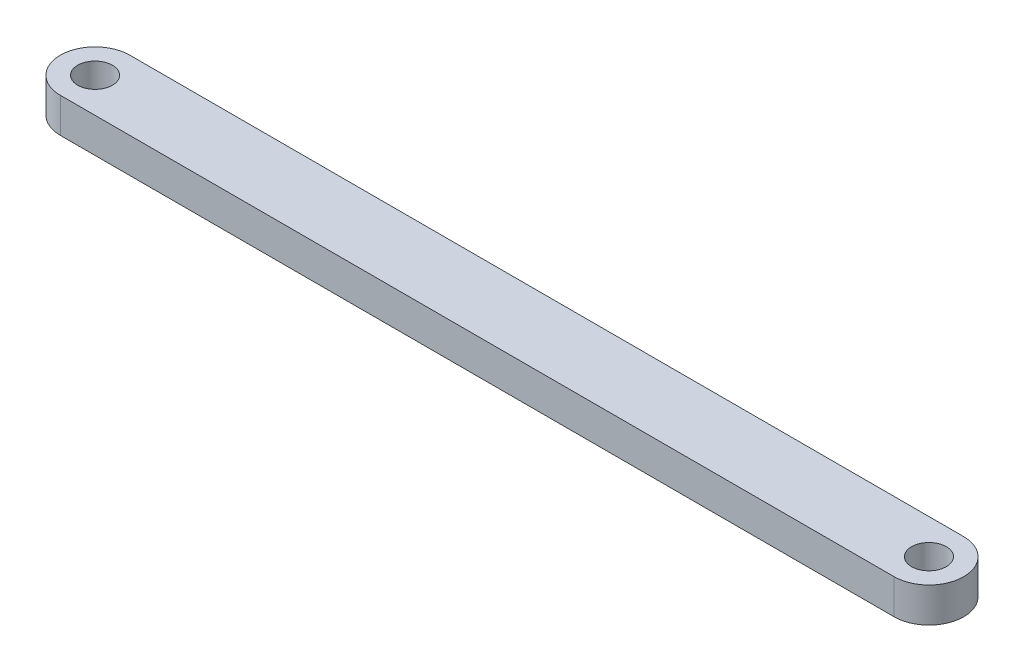
ISO-10303-21;
HEADER;
FILE_DESCRIPTION(('STEP AP214'),'2;1');
FILE_NAME('part.step','',(''),(''),'','','');
FILE_SCHEMA(('AUTOMOTIVE_DESIGN { 1 0 10303 214 1 1 1 1 }'));
ENDSEC;
DATA;
#1=APPLICATION_CONTEXT('core data for automotive mechanical design processes');
#2=APPLICATION_PROTOCOL_DEFINITION('international standard','automotive_design',2000,#1);
#3=PRODUCT_CONTEXT('',#1,'mechanical');
#4=PRODUCT('Part','Part','',(#3));
#5=PRODUCT_RELATED_PRODUCT_CATEGORY('part','',(#4));
#6=PRODUCT_DEFINITION_FORMATION('','',#4);
#7=PRODUCT_DEFINITION_CONTEXT('part definition',#1,'design');
#8=PRODUCT_DEFINITION('design','',#6,#7);
#9=PRODUCT_DEFINITION_SHAPE('','',#8);
#10=(LENGTH_UNIT() NAMED_UNIT(*) SI_UNIT(.MILLI.,.METRE.));
#11=(NAMED_UNIT(*) PLANE_ANGLE_UNIT() SI_UNIT($,.RADIAN.));
#12=(NAMED_UNIT(*) SI_UNIT($,.STERADIAN.) SOLID_ANGLE_UNIT());
#13=UNCERTAINTY_MEASURE_WITH_UNIT(LENGTH_MEASURE(1.E-05),#10,'distance_accuracy_value','');
#14=(GEOMETRIC_REPRESENTATION_CONTEXT(3) GLOBAL_UNCERTAINTY_ASSIGNED_CONTEXT((#13)) GLOBAL_UNIT_ASSIGNED_CONTEXT((#10,
#11,#12)) REPRESENTATION_CONTEXT('',''));
#15=CARTESIAN_POINT('',(0.,0.,0.));
#16=DIRECTION('',(0.,0.,1.));
#17=DIRECTION('',(1.,0.,0.));
#18=AXIS2_PLACEMENT_3D('',#15,#16,#17);
#19=CARTESIAN_POINT('',(60.,5.,0.));
#20=DIRECTION('',(0.,1.,0.));
#21=DIRECTION('',(0.,0.,1.));
#22=AXIS2_PLACEMENT_3D('',#19,#20,#21);
#23=PLANE('',#22);
#24=CARTESIAN_POINT('',(60.,5.,0.));
#25=DIRECTION('',(0.,1.,0.));
#26=DIRECTION('',(0.,0.,1.));
#27=AXIS2_PLACEMENT_3D('',#24,#25,#26);
#28=CIRCLE('',#27,2.50000000000002);
#29=CARTESIAN_POINT('',(60.,5.,2.49999999999999));
#30=VERTEX_POINT('',#29);
#31=EDGE_CURVE('E115',#30,#30,#28,.T.);
#32=ORIENTED_EDGE('',*,*,#31,.F.);
#33=EDGE_LOOP('',(#32));
#34=FACE_BOUND('',#33,.T.);
#35=CARTESIAN_POINT('',(60.,5.,0.));
#36=DIRECTION('',(0.,1.,0.));
#37=DIRECTION('',(0.,0.,1.));
#38=AXIS2_PLACEMENT_3D('',#35,#36,#37);
#39=CIRCLE('',#38,4.99999999999998);
#40=CARTESIAN_POINT('',(60.,5.,4.99999999999995));
#41=VERTEX_POINT('',#40);
#42=CARTESIAN_POINT('',(60.,5.,-5.));
#43=VERTEX_POINT('',#42);
#44=EDGE_CURVE('E95',#41,#43,#39,.T.);
#45=ORIENTED_EDGE('',*,*,#44,.T.);
#46=DIRECTION('',(-1.,0.,0.));
#47=VECTOR('',#46,1.);
#48=CARTESIAN_POINT('',(60.,5.,-5.));
#49=LINE('',#48,#47);
#50=CARTESIAN_POINT('',(-60.,5.,-4.99999999999996));
#51=VERTEX_POINT('',#50);
#52=EDGE_CURVE('E90',#43,#51,#49,.T.);
#53=ORIENTED_EDGE('',*,*,#52,.T.);
#54=CARTESIAN_POINT('',(-60.,5.,0.));
#55=DIRECTION('',(0.,1.,0.));
#56=DIRECTION('',(0.,0.,1.));
#57=AXIS2_PLACEMENT_3D('',#54,#55,#56);
#58=CIRCLE('',#57,4.99999999999998);
#59=CARTESIAN_POINT('',(-60.,5.,4.99999999999999));
#60=VERTEX_POINT('',#59);
#61=EDGE_CURVE('E93',#51,#60,#58,.T.);
#62=ORIENTED_EDGE('',*,*,#61,.T.);
#63=DIRECTION('',(1.,0.,0.));
#64=VECTOR('',#63,1.);
#65=CARTESIAN_POINT('',(60.,5.,4.99999999999995));
#66=LINE('',#65,#64);
#67=EDGE_CURVE('E60',#60,#41,#66,.T.);
#68=ORIENTED_EDGE('',*,*,#67,.T.);
#69=EDGE_LOOP('',(#45,#53,#62,#68));
#70=FACE_BOUND('',#69,.T.);
#71=CARTESIAN_POINT('',(-60.,5.,0.));
#72=DIRECTION('',(0.,1.,0.));
#73=DIRECTION('',(0.,0.,1.));
#74=AXIS2_PLACEMENT_3D('',#71,#72,#73);
#75=CIRCLE('',#74,2.50000000000001);
#76=CARTESIAN_POINT('',(-60.,5.,2.50000000000002));
#77=VERTEX_POINT('',#76);
#78=EDGE_CURVE('E137',#77,#77,#75,.T.);
#79=ORIENTED_EDGE('',*,*,#78,.F.);
#80=EDGE_LOOP('',(#79));
#81=FACE_BOUND('',#80,.T.);
#82=ADVANCED_FACE('F42',(#34,#70,#81),#23,.T.);
#83=CARTESIAN_POINT('',(60.,0.,0.));
#84=DIRECTION('',(0.,1.,0.));
#85=DIRECTION('',(0.,0.,1.));
#86=AXIS2_PLACEMENT_3D('',#83,#84,#85);
#87=PLANE('',#86);
#88=CARTESIAN_POINT('',(60.,0.,0.));
#89=DIRECTION('',(0.,1.,0.));
#90=DIRECTION('',(0.,0.,1.));
#91=AXIS2_PLACEMENT_3D('',#88,#89,#90);
#92=CIRCLE('',#91,4.99999999999998);
#93=CARTESIAN_POINT('',(60.,0.,4.99999999999995));
#94=VERTEX_POINT('',#93);
#95=CARTESIAN_POINT('',(60.,0.,-5.));
#96=VERTEX_POINT('',#95);
#97=EDGE_CURVE('E111',#94,#96,#92,.T.);
#98=ORIENTED_EDGE('',*,*,#97,.F.);
#99=DIRECTION('',(1.,0.,0.));
#100=VECTOR('',#99,1.);
#101=CARTESIAN_POINT('',(60.,0.,4.99999999999995));
#102=LINE('',#101,#100);
#103=CARTESIAN_POINT('',(-60.,0.,4.99999999999999));
#104=VERTEX_POINT('',#103);
#105=EDGE_CURVE('E83',#104,#94,#102,.T.);
#106=ORIENTED_EDGE('',*,*,#105,.F.);
#107=CARTESIAN_POINT('',(-60.,0.,0.));
#108=DIRECTION('',(0.,1.,0.));
#109=DIRECTION('',(0.,0.,1.));
#110=AXIS2_PLACEMENT_3D('',#107,#108,#109);
#111=CIRCLE('',#110,4.99999999999998);
#112=CARTESIAN_POINT('',(-60.,0.,-4.99999999999996));
#113=VERTEX_POINT('',#112);
#114=EDGE_CURVE('E77',#113,#104,#111,.T.);
#115=ORIENTED_EDGE('',*,*,#114,.F.);
#116=DIRECTION('',(-1.,0.,0.));
#117=VECTOR('',#116,1.);
#118=CARTESIAN_POINT('',(60.,0.,-5.));
#119=LINE('',#118,#117);
#120=EDGE_CURVE('E100',#96,#113,#119,.T.);
#121=ORIENTED_EDGE('',*,*,#120,.F.);
#122=EDGE_LOOP('',(#98,#106,#115,#121));
#123=FACE_BOUND('',#122,.T.);
#124=CARTESIAN_POINT('',(60.,0.,0.));
#125=DIRECTION('',(0.,1.,0.));
#126=DIRECTION('',(0.,0.,1.));
#127=AXIS2_PLACEMENT_3D('',#124,#125,#126);
#128=CIRCLE('',#127,2.50000000000002);
#129=CARTESIAN_POINT('',(60.,0.,2.49999999999999));
#130=VERTEX_POINT('',#129);
#131=EDGE_CURVE('E133',#130,#130,#128,.T.);
#132=ORIENTED_EDGE('',*,*,#131,.T.);
#133=EDGE_LOOP('',(#132));
#134=FACE_BOUND('',#133,.T.);
#135=CARTESIAN_POINT('',(-60.,0.,0.));
#136=DIRECTION('',(0.,1.,0.));
#137=DIRECTION('',(0.,0.,1.));
#138=AXIS2_PLACEMENT_3D('',#135,#136,#137);
#139=CIRCLE('',#138,2.50000000000001);
#140=CARTESIAN_POINT('',(-60.,0.,2.50000000000002));
#141=VERTEX_POINT('',#140);
#142=EDGE_CURVE('E141',#141,#141,#139,.T.);
#143=ORIENTED_EDGE('',*,*,#142,.T.);
#144=EDGE_LOOP('',(#143));
#145=FACE_BOUND('',#144,.T.);
#146=ADVANCED_FACE('F128',(#123,#134,#145),#87,.F.);
#147=CARTESIAN_POINT('',(60.,5.,0.));
#148=DIRECTION('',(0.,-1.,0.));
#149=DIRECTION('',(0.,0.,-1.));
#150=AXIS2_PLACEMENT_3D('',#147,#148,#149);
#151=CYLINDRICAL_SURFACE('',#150,4.99999999999998);
#152=ORIENTED_EDGE('',*,*,#97,.T.);
#153=DIRECTION('',(0.,-1.,0.));
#154=VECTOR('',#153,1.);
#155=CARTESIAN_POINT('',(60.,5.,-5.));
#156=LINE('',#155,#154);
#157=EDGE_CURVE('E11',#43,#96,#156,.T.);
#158=ORIENTED_EDGE('',*,*,#157,.F.);
#159=ORIENTED_EDGE('',*,*,#44,.F.);
#160=DIRECTION('',(0.,-1.,0.));
#161=VECTOR('',#160,1.);
#162=CARTESIAN_POINT('',(60.,5.,4.99999999999995));
#163=LINE('',#162,#161);
#164=EDGE_CURVE('E107',#41,#94,#163,.T.);
#165=ORIENTED_EDGE('',*,*,#164,.T.);
#166=EDGE_LOOP('',(#152,#158,#159,#165));
#167=FACE_BOUND('',#166,.T.);
#168=ADVANCED_FACE('F44',(#167),#151,.T.);
#169=CARTESIAN_POINT('',(60.,5.,-5.));
#170=DIRECTION('',(0.,0.,1.));
#171=DIRECTION('',(1.,0.,0.));
#172=AXIS2_PLACEMENT_3D('',#169,#170,#171);
#173=PLANE('',#172);
#174=ORIENTED_EDGE('',*,*,#120,.T.);
#175=DIRECTION('',(0.,-1.,0.));
#176=VECTOR('',#175,1.);
#177=CARTESIAN_POINT('',(-60.,5.,-4.99999999999996));
#178=LINE('',#177,#176);
#179=EDGE_CURVE('E52',#51,#113,#178,.T.);
#180=ORIENTED_EDGE('',*,*,#179,.F.);
#181=ORIENTED_EDGE('',*,*,#52,.F.);
#182=ORIENTED_EDGE('',*,*,#157,.T.);
#183=EDGE_LOOP('',(#174,#180,#181,#182));
#184=FACE_BOUND('',#183,.T.);
#185=ADVANCED_FACE('F99',(#184),#173,.F.);
#186=CARTESIAN_POINT('',(-60.,5.,0.));
#187=DIRECTION('',(0.,-1.,0.));
#188=DIRECTION('',(0.,0.,-1.));
#189=AXIS2_PLACEMENT_3D('',#186,#187,#188);
#190=CYLINDRICAL_SURFACE('',#189,4.99999999999998);
#191=ORIENTED_EDGE('',*,*,#114,.T.);
#192=DIRECTION('',(0.,-1.,0.));
#193=VECTOR('',#192,1.);
#194=CARTESIAN_POINT('',(-60.,5.,4.99999999999999));
#195=LINE('',#194,#193);
#196=EDGE_CURVE('E102',#60,#104,#195,.T.);
#197=ORIENTED_EDGE('',*,*,#196,.F.);
#198=ORIENTED_EDGE('',*,*,#61,.F.);
#199=ORIENTED_EDGE('',*,*,#179,.T.);
#200=EDGE_LOOP('',(#191,#197,#198,#199));
#201=FACE_BOUND('',#200,.T.);
#202=ADVANCED_FACE('F103',(#201),#190,.T.);
#203=CARTESIAN_POINT('',(60.,5.,4.99999999999995));
#204=DIRECTION('',(0.,0.,-1.));
#205=DIRECTION('',(-1.,0.,0.));
#206=AXIS2_PLACEMENT_3D('',#203,#204,#205);
#207=PLANE('',#206);
#208=ORIENTED_EDGE('',*,*,#105,.T.);
#209=ORIENTED_EDGE('',*,*,#164,.F.);
#210=ORIENTED_EDGE('',*,*,#67,.F.);
#211=ORIENTED_EDGE('',*,*,#196,.T.);
#212=EDGE_LOOP('',(#208,#209,#210,#211));
#213=FACE_BOUND('',#212,.T.);
#214=ADVANCED_FACE('F125',(#213),#207,.F.);
#215=CARTESIAN_POINT('',(60.,5.,0.));
#216=DIRECTION('',(0.,-1.,0.));
#217=DIRECTION('',(0.,0.,-1.));
#218=AXIS2_PLACEMENT_3D('',#215,#216,#217);
#219=CYLINDRICAL_SURFACE('',#218,2.50000000000002);
#220=ORIENTED_EDGE('',*,*,#31,.T.);
#221=EDGE_LOOP('',(#220));
#222=FACE_BOUND('',#221,.T.);
#223=ORIENTED_EDGE('',*,*,#131,.F.);
#224=EDGE_LOOP('',(#223));
#225=FACE_BOUND('',#224,.T.);
#226=ADVANCED_FACE('F160',(#222,#225),#219,.F.);
#227=CARTESIAN_POINT('',(-60.,5.,0.));
#228=DIRECTION('',(0.,-1.,0.));
#229=DIRECTION('',(0.,0.,-1.));
#230=AXIS2_PLACEMENT_3D('',#227,#228,#229);
#231=CYLINDRICAL_SURFACE('',#230,2.50000000000001);
#232=ORIENTED_EDGE('',*,*,#78,.T.);
#233=EDGE_LOOP('',(#232));
#234=FACE_BOUND('',#233,.T.);
#235=ORIENTED_EDGE('',*,*,#142,.F.);
#236=EDGE_LOOP('',(#235));
#237=FACE_BOUND('',#236,.T.);
#238=ADVANCED_FACE('F149',(#234,#237),#231,.F.);
#239=CLOSED_SHELL('',(#82,#146,#168,#185,#202,#214,#226,#238));
#240=MANIFOLD_SOLID_BREP('B2',#239);
#241=ADVANCED_BREP_SHAPE_REPRESENTATION('',(#18,#240),#14);
#242=SHAPE_DEFINITION_REPRESENTATION(#9,#241);
ENDSEC;
END-ISO-10303-21;
